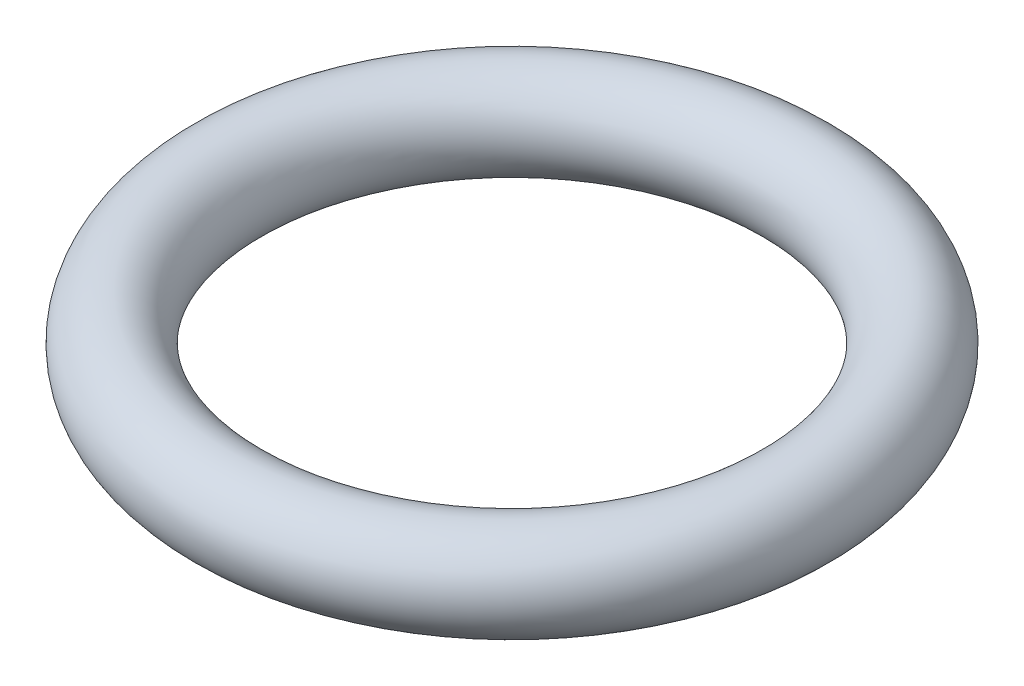
ISO-10303-21;
HEADER;
FILE_DESCRIPTION(('STEP AP214'),'2;1');
FILE_NAME('part.step','',(''),(''),'','','');
FILE_SCHEMA(('AUTOMOTIVE_DESIGN { 1 0 10303 214 1 1 1 1 }'));
ENDSEC;
DATA;
#1=APPLICATION_CONTEXT('core data for automotive mechanical design processes');
#2=APPLICATION_PROTOCOL_DEFINITION('international standard','automotive_design',2000,#1);
#3=PRODUCT_CONTEXT('',#1,'mechanical');
#4=PRODUCT('Part','Part','',(#3));
#5=PRODUCT_RELATED_PRODUCT_CATEGORY('part','',(#4));
#6=PRODUCT_DEFINITION_FORMATION('','',#4);
#7=PRODUCT_DEFINITION_CONTEXT('part definition',#1,'design');
#8=PRODUCT_DEFINITION('design','',#6,#7);
#9=PRODUCT_DEFINITION_SHAPE('','',#8);
#10=(LENGTH_UNIT() NAMED_UNIT(*) SI_UNIT(.MILLI.,.METRE.));
#11=(NAMED_UNIT(*) PLANE_ANGLE_UNIT() SI_UNIT($,.RADIAN.));
#12=(NAMED_UNIT(*) SI_UNIT($,.STERADIAN.) SOLID_ANGLE_UNIT());
#13=UNCERTAINTY_MEASURE_WITH_UNIT(LENGTH_MEASURE(1.E-05),#10,'distance_accuracy_value','');
#14=(GEOMETRIC_REPRESENTATION_CONTEXT(3) GLOBAL_UNCERTAINTY_ASSIGNED_CONTEXT((#13)) GLOBAL_UNIT_ASSIGNED_CONTEXT((#10,
#11,#12)) REPRESENTATION_CONTEXT('',''));
#15=CARTESIAN_POINT('',(0.,0.,0.));
#16=DIRECTION('',(0.,0.,1.));
#17=DIRECTION('',(1.,0.,0.));
#18=AXIS2_PLACEMENT_3D('',#15,#16,#17);
#19=CARTESIAN_POINT('',(0.,0.,0.));
#20=DIRECTION('',(0.,1.,0.));
#21=DIRECTION('',(0.,0.,1.));
#22=AXIS2_PLACEMENT_3D('',#19,#20,#21);
#23=TOROIDAL_SURFACE('',#22,15.25,2.5);
#24=CARTESIAN_POINT('',(0.,0.,17.75));
#25=VERTEX_POINT('',#24);
#26=VERTEX_LOOP('',#25);
#27=FACE_BOUND('',#26,.T.);
#28=ADVANCED_FACE('F29',(#27),#23,.T.);
#29=CLOSED_SHELL('',(#28));
#30=MANIFOLD_SOLID_BREP('B2',#29);
#31=ADVANCED_BREP_SHAPE_REPRESENTATION('',(#18,#30),#14);
#32=SHAPE_DEFINITION_REPRESENTATION(#9,#31);
ENDSEC;
END-ISO-10303-21;
